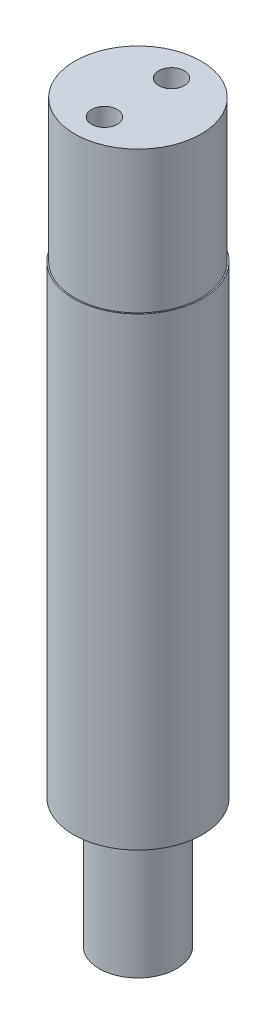
ISO-10303-21;
HEADER;
FILE_DESCRIPTION(('STEP AP214'),'2;1');
FILE_NAME('part.step','',(''),(''),'','','');
FILE_SCHEMA(('AUTOMOTIVE_DESIGN { 1 0 10303 214 1 1 1 1 }'));
ENDSEC;
DATA;
#1=APPLICATION_CONTEXT('core data for automotive mechanical design processes');
#2=APPLICATION_PROTOCOL_DEFINITION('international standard','automotive_design',2000,#1);
#3=PRODUCT_CONTEXT('',#1,'mechanical');
#4=PRODUCT('Part','Part','',(#3));
#5=PRODUCT_RELATED_PRODUCT_CATEGORY('part','',(#4));
#6=PRODUCT_DEFINITION_FORMATION('','',#4);
#7=PRODUCT_DEFINITION_CONTEXT('part definition',#1,'design');
#8=PRODUCT_DEFINITION('design','',#6,#7);
#9=PRODUCT_DEFINITION_SHAPE('','',#8);
#10=(LENGTH_UNIT() NAMED_UNIT(*) SI_UNIT(.MILLI.,.METRE.));
#11=(NAMED_UNIT(*) PLANE_ANGLE_UNIT() SI_UNIT($,.RADIAN.));
#12=(NAMED_UNIT(*) SI_UNIT($,.STERADIAN.) SOLID_ANGLE_UNIT());
#13=UNCERTAINTY_MEASURE_WITH_UNIT(LENGTH_MEASURE(1.E-05),#10,'distance_accuracy_value','');
#14=(GEOMETRIC_REPRESENTATION_CONTEXT(3) GLOBAL_UNCERTAINTY_ASSIGNED_CONTEXT((#13)) GLOBAL_UNIT_ASSIGNED_CONTEXT((#10,
#11,#12)) REPRESENTATION_CONTEXT('',''));
#15=CARTESIAN_POINT('',(0.,0.,0.));
#16=DIRECTION('',(0.,0.,1.));
#17=DIRECTION('',(1.,0.,0.));
#18=AXIS2_PLACEMENT_3D('',#15,#16,#17);
#19=CARTESIAN_POINT('',(0.,20.5,0.));
#20=DIRECTION('',(0.,1.,0.));
#21=DIRECTION('',(1.,0.,0.));
#22=AXIS2_PLACEMENT_3D('',#19,#20,#21);
#23=PLANE('',#22);
#24=CARTESIAN_POINT('',(0.,20.5,-1.3));
#25=DIRECTION('',(0.,1.,0.));
#26=DIRECTION('',(0.,0.,1.));
#27=AXIS2_PLACEMENT_3D('',#24,#25,#26);
#28=CIRCLE('',#27,0.5);
#29=CARTESIAN_POINT('',(0.,20.5,-1.8));
#30=VERTEX_POINT('',#29);
#31=EDGE_CURVE('E108',#30,#30,#28,.T.);
#32=ORIENTED_EDGE('',*,*,#31,.T.);
#33=EDGE_LOOP('',(#32));
#34=FACE_BOUND('',#33,.T.);
#35=ADVANCED_FACE('F17',(#34),#23,.T.);
#36=CARTESIAN_POINT('',(0.,20.5,0.));
#37=DIRECTION('',(0.,1.,0.));
#38=DIRECTION('',(1.,0.,0.));
#39=AXIS2_PLACEMENT_3D('',#36,#37,#38);
#40=PLANE('',#39);
#41=CARTESIAN_POINT('',(0.,20.5,1.3));
#42=DIRECTION('',(0.,1.,0.));
#43=DIRECTION('',(0.,0.,1.));
#44=AXIS2_PLACEMENT_3D('',#41,#42,#43);
#45=CIRCLE('',#44,0.5);
#46=CARTESIAN_POINT('',(0.,20.5,0.8));
#47=VERTEX_POINT('',#46);
#48=EDGE_CURVE('E86',#47,#47,#45,.T.);
#49=ORIENTED_EDGE('',*,*,#48,.T.);
#50=EDGE_LOOP('',(#49));
#51=FACE_BOUND('',#50,.T.);
#52=ADVANCED_FACE('F139',(#51),#40,.T.);
#53=CARTESIAN_POINT('',(0.,-5.,0.));
#54=DIRECTION('',(0.,-1.,0.));
#55=DIRECTION('',(0.,0.,-1.));
#56=AXIS2_PLACEMENT_3D('',#53,#54,#55);
#57=PLANE('',#56);
#58=CARTESIAN_POINT('',(0.,-5.,0.));
#59=DIRECTION('',(0.,1.,0.));
#60=DIRECTION('',(0.,0.,-1.));
#61=AXIS2_PLACEMENT_3D('',#58,#59,#60);
#62=CIRCLE('',#61,1.5);
#63=CARTESIAN_POINT('',(0.,-5.,1.5));
#64=VERTEX_POINT('',#63);
#65=EDGE_CURVE('E77',#64,#64,#62,.T.);
#66=ORIENTED_EDGE('',*,*,#65,.F.);
#67=EDGE_LOOP('',(#66));
#68=FACE_BOUND('',#67,.T.);
#69=ADVANCED_FACE('F135',(#68),#57,.T.);
#70=CARTESIAN_POINT('',(0.,23.5,0.));
#71=DIRECTION('',(0.,1.,0.));
#72=DIRECTION('',(1.,0.,0.));
#73=AXIS2_PLACEMENT_3D('',#70,#71,#72);
#74=PLANE('',#73);
#75=CARTESIAN_POINT('',(0.,23.5,-1.3));
#76=DIRECTION('',(0.,-1.,0.));
#77=DIRECTION('',(0.,0.,1.));
#78=AXIS2_PLACEMENT_3D('',#75,#76,#77);
#79=CIRCLE('',#78,0.5);
#80=CARTESIAN_POINT('',(0.,23.5,-1.8));
#81=VERTEX_POINT('',#80);
#82=EDGE_CURVE('E11',#81,#81,#79,.T.);
#83=ORIENTED_EDGE('',*,*,#82,.T.);
#84=EDGE_LOOP('',(#83));
#85=FACE_BOUND('',#84,.T.);
#86=CARTESIAN_POINT('',(0.,23.5,1.3));
#87=DIRECTION('',(0.,-1.,0.));
#88=DIRECTION('',(0.,0.,1.));
#89=AXIS2_PLACEMENT_3D('',#86,#87,#88);
#90=CIRCLE('',#89,0.5);
#91=CARTESIAN_POINT('',(0.,23.5,0.8));
#92=VERTEX_POINT('',#91);
#93=EDGE_CURVE('E21',#92,#92,#90,.T.);
#94=ORIENTED_EDGE('',*,*,#93,.T.);
#95=EDGE_LOOP('',(#94));
#96=FACE_BOUND('',#95,.T.);
#97=CARTESIAN_POINT('',(0.,23.5,0.));
#98=DIRECTION('',(0.,-1.,0.));
#99=DIRECTION('',(0.,0.,1.));
#100=AXIS2_PLACEMENT_3D('',#97,#98,#99);
#101=CIRCLE('',#100,2.45);
#102=CARTESIAN_POINT('',(0.,23.5,-2.45));
#103=VERTEX_POINT('',#102);
#104=EDGE_CURVE('E92',#103,#103,#101,.T.);
#105=ORIENTED_EDGE('',*,*,#104,.F.);
#106=EDGE_LOOP('',(#105));
#107=FACE_BOUND('',#106,.T.);
#108=ADVANCED_FACE('F125',(#85,#96,#107),#74,.T.);
#109=CARTESIAN_POINT('',(0.,0.,0.));
#110=DIRECTION('',(0.,-1.,0.));
#111=DIRECTION('',(0.,0.,-1.));
#112=AXIS2_PLACEMENT_3D('',#109,#110,#111);
#113=PLANE('',#112);
#114=CARTESIAN_POINT('',(0.,0.,0.));
#115=DIRECTION('',(0.,1.,0.));
#116=DIRECTION('',(0.,0.,-1.));
#117=AXIS2_PLACEMENT_3D('',#114,#115,#116);
#118=CIRCLE('',#117,1.5);
#119=CARTESIAN_POINT('',(0.,0.,1.5));
#120=VERTEX_POINT('',#119);
#121=EDGE_CURVE('E78',#120,#120,#118,.T.);
#122=ORIENTED_EDGE('',*,*,#121,.T.);
#123=EDGE_LOOP('',(#122));
#124=FACE_BOUND('',#123,.T.);
#125=CARTESIAN_POINT('',(0.,0.,0.));
#126=DIRECTION('',(0.,1.,0.));
#127=DIRECTION('',(0.,0.,-1.));
#128=AXIS2_PLACEMENT_3D('',#125,#126,#127);
#129=CIRCLE('',#128,2.5);
#130=CARTESIAN_POINT('',(0.,0.,2.5));
#131=VERTEX_POINT('',#130);
#132=EDGE_CURVE('E102',#131,#131,#129,.T.);
#133=ORIENTED_EDGE('',*,*,#132,.F.);
#134=EDGE_LOOP('',(#133));
#135=FACE_BOUND('',#134,.T.);
#136=ADVANCED_FACE('F123',(#124,#135),#113,.T.);
#137=CARTESIAN_POINT('',(0.,18.,0.));
#138=DIRECTION('',(0.,-1.,0.));
#139=DIRECTION('',(0.,0.,-1.));
#140=AXIS2_PLACEMENT_3D('',#137,#138,#139);
#141=PLANE('',#140);
#142=CARTESIAN_POINT('',(0.,18.,0.));
#143=DIRECTION('',(0.,1.,0.));
#144=DIRECTION('',(0.,0.,1.));
#145=AXIS2_PLACEMENT_3D('',#142,#143,#144);
#146=CIRCLE('',#145,2.45);
#147=CARTESIAN_POINT('',(0.,18.,-2.45));
#148=VERTEX_POINT('',#147);
#149=EDGE_CURVE('E88',#148,#148,#146,.T.);
#150=ORIENTED_EDGE('',*,*,#149,.F.);
#151=EDGE_LOOP('',(#150));
#152=FACE_BOUND('',#151,.T.);
#153=CARTESIAN_POINT('',(0.,18.,0.));
#154=DIRECTION('',(0.,-1.,0.));
#155=DIRECTION('',(0.,0.,-1.));
#156=AXIS2_PLACEMENT_3D('',#153,#154,#155);
#157=CIRCLE('',#156,2.5);
#158=CARTESIAN_POINT('',(0.,18.,2.5));
#159=VERTEX_POINT('',#158);
#160=EDGE_CURVE('E101',#159,#159,#157,.T.);
#161=ORIENTED_EDGE('',*,*,#160,.F.);
#162=EDGE_LOOP('',(#161));
#163=FACE_BOUND('',#162,.T.);
#164=ADVANCED_FACE('F19',(#152,#163),#141,.F.);
#165=CARTESIAN_POINT('',(0.,23.5,-1.3));
#166=DIRECTION('',(0.,1.,0.));
#167=DIRECTION('',(0.,0.,1.));
#168=AXIS2_PLACEMENT_3D('',#165,#166,#167);
#169=CYLINDRICAL_SURFACE('',#168,0.5);
#170=ORIENTED_EDGE('',*,*,#31,.F.);
#171=DIRECTION('',(0.,1.,0.));
#172=VECTOR('',#171,1.);
#173=CARTESIAN_POINT('',(0.,23.5,-1.8));
#174=LINE('',#173,#172);
#175=EDGE_CURVE('E28',#30,#81,#174,.T.);
#176=ORIENTED_EDGE('',*,*,#175,.T.);
#177=ORIENTED_EDGE('',*,*,#82,.F.);
#178=ORIENTED_EDGE('',*,*,#175,.F.);
#179=EDGE_LOOP('',(#170,#176,#177,#178));
#180=FACE_BOUND('',#179,.T.);
#181=ADVANCED_FACE('F133',(#180),#169,.F.);
#182=CARTESIAN_POINT('',(0.,23.5,1.3));
#183=DIRECTION('',(0.,1.,0.));
#184=DIRECTION('',(0.,0.,1.));
#185=AXIS2_PLACEMENT_3D('',#182,#183,#184);
#186=CYLINDRICAL_SURFACE('',#185,0.5);
#187=ORIENTED_EDGE('',*,*,#48,.F.);
#188=DIRECTION('',(0.,1.,0.));
#189=VECTOR('',#188,1.);
#190=CARTESIAN_POINT('',(0.,23.5,0.8));
#191=LINE('',#190,#189);
#192=EDGE_CURVE('E114',#47,#92,#191,.T.);
#193=ORIENTED_EDGE('',*,*,#192,.T.);
#194=ORIENTED_EDGE('',*,*,#93,.F.);
#195=ORIENTED_EDGE('',*,*,#192,.F.);
#196=EDGE_LOOP('',(#187,#193,#194,#195));
#197=FACE_BOUND('',#196,.T.);
#198=ADVANCED_FACE('F153',(#197),#186,.F.);
#199=CARTESIAN_POINT('',(0.,0.,0.));
#200=DIRECTION('',(0.,-1.,0.));
#201=DIRECTION('',(0.,0.,-1.));
#202=AXIS2_PLACEMENT_3D('',#199,#200,#201);
#203=CYLINDRICAL_SURFACE('',#202,1.5);
#204=ORIENTED_EDGE('',*,*,#65,.T.);
#205=DIRECTION('',(0.,1.,0.));
#206=VECTOR('',#205,1.);
#207=CARTESIAN_POINT('',(0.,0.,1.5));
#208=LINE('',#207,#206);
#209=EDGE_CURVE('E74',#64,#120,#208,.T.);
#210=ORIENTED_EDGE('',*,*,#209,.T.);
#211=ORIENTED_EDGE('',*,*,#121,.F.);
#212=ORIENTED_EDGE('',*,*,#209,.F.);
#213=EDGE_LOOP('',(#204,#210,#211,#212));
#214=FACE_BOUND('',#213,.T.);
#215=ADVANCED_FACE('F75',(#214),#203,.T.);
#216=CARTESIAN_POINT('',(0.,18.,0.));
#217=DIRECTION('',(0.,1.,0.));
#218=DIRECTION('',(0.,0.,1.));
#219=AXIS2_PLACEMENT_3D('',#216,#217,#218);
#220=CYLINDRICAL_SURFACE('',#219,2.45);
#221=ORIENTED_EDGE('',*,*,#104,.T.);
#222=DIRECTION('',(0.,-1.,0.));
#223=VECTOR('',#222,1.);
#224=CARTESIAN_POINT('',(0.,18.,-2.45));
#225=LINE('',#224,#223);
#226=EDGE_CURVE('E96',#103,#148,#225,.T.);
#227=ORIENTED_EDGE('',*,*,#226,.T.);
#228=ORIENTED_EDGE('',*,*,#149,.T.);
#229=ORIENTED_EDGE('',*,*,#226,.F.);
#230=EDGE_LOOP('',(#221,#227,#228,#229));
#231=FACE_BOUND('',#230,.T.);
#232=ADVANCED_FACE('F151',(#231),#220,.T.);
#233=CARTESIAN_POINT('',(0.,18.9,0.));
#234=DIRECTION('',(0.,-1.,0.));
#235=DIRECTION('',(0.,0.,-1.));
#236=AXIS2_PLACEMENT_3D('',#233,#234,#235);
#237=CYLINDRICAL_SURFACE('',#236,2.5);
#238=ORIENTED_EDGE('',*,*,#132,.T.);
#239=DIRECTION('',(0.,1.,0.));
#240=VECTOR('',#239,1.);
#241=CARTESIAN_POINT('',(0.,18.9,2.5));
#242=LINE('',#241,#240);
#243=EDGE_CURVE('E97',#131,#159,#242,.T.);
#244=ORIENTED_EDGE('',*,*,#243,.T.);
#245=ORIENTED_EDGE('',*,*,#160,.T.);
#246=ORIENTED_EDGE('',*,*,#243,.F.);
#247=EDGE_LOOP('',(#238,#244,#245,#246));
#248=FACE_BOUND('',#247,.T.);
#249=ADVANCED_FACE('F121',(#248),#237,.T.);
#250=CLOSED_SHELL('',(#35,#52,#69,#108,#136,#164,#181,#198,#215,#232,#249));
#251=MANIFOLD_SOLID_BREP('B1',#250);
#252=ADVANCED_BREP_SHAPE_REPRESENTATION('',(#18,#251),#14);
#253=SHAPE_DEFINITION_REPRESENTATION(#9,#252);
ENDSEC;
END-ISO-10303-21;
